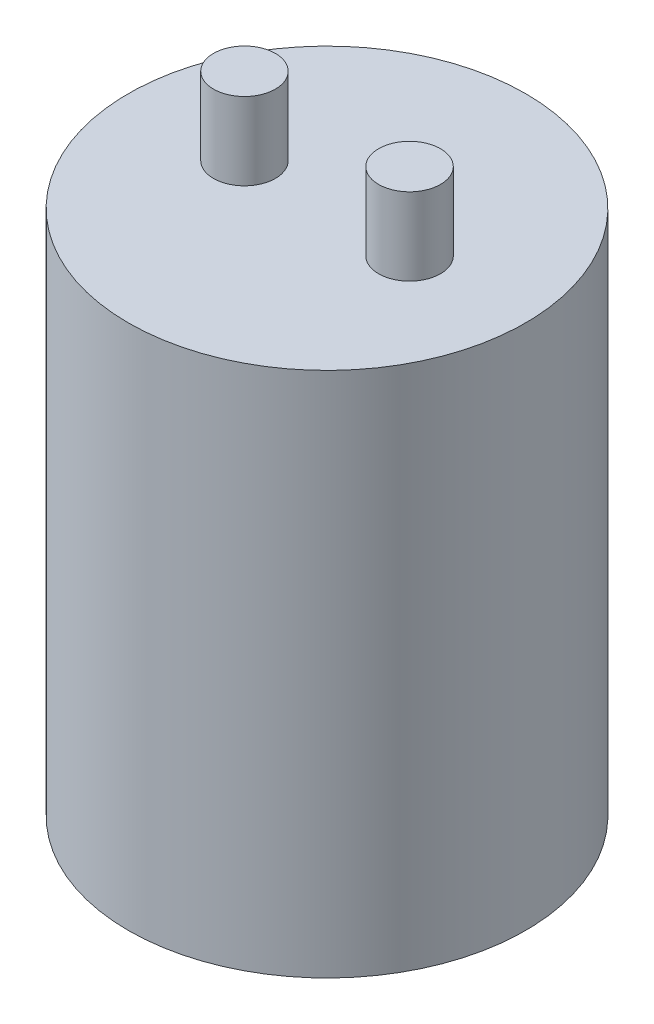
ISO-10303-21;
HEADER;
FILE_DESCRIPTION(('STEP AP214'),'2;1');
FILE_NAME('part.step','',(''),(''),'','','');
FILE_SCHEMA(('AUTOMOTIVE_DESIGN { 1 0 10303 214 1 1 1 1 }'));
ENDSEC;
DATA;
#1=APPLICATION_CONTEXT('core data for automotive mechanical design processes');
#2=APPLICATION_PROTOCOL_DEFINITION('international standard','automotive_design',2000,#1);
#3=PRODUCT_CONTEXT('',#1,'mechanical');
#4=PRODUCT('Part','Part','',(#3));
#5=PRODUCT_RELATED_PRODUCT_CATEGORY('part','',(#4));
#6=PRODUCT_DEFINITION_FORMATION('','',#4);
#7=PRODUCT_DEFINITION_CONTEXT('part definition',#1,'design');
#8=PRODUCT_DEFINITION('design','',#6,#7);
#9=PRODUCT_DEFINITION_SHAPE('','',#8);
#10=(LENGTH_UNIT() NAMED_UNIT(*) SI_UNIT(.MILLI.,.METRE.));
#11=(NAMED_UNIT(*) PLANE_ANGLE_UNIT() SI_UNIT($,.RADIAN.));
#12=(NAMED_UNIT(*) SI_UNIT($,.STERADIAN.) SOLID_ANGLE_UNIT());
#13=UNCERTAINTY_MEASURE_WITH_UNIT(LENGTH_MEASURE(1.E-05),#10,'distance_accuracy_value','');
#14=(GEOMETRIC_REPRESENTATION_CONTEXT(3) GLOBAL_UNCERTAINTY_ASSIGNED_CONTEXT((#13)) GLOBAL_UNIT_ASSIGNED_CONTEXT((#10,
#11,#12)) REPRESENTATION_CONTEXT('',''));
#15=CARTESIAN_POINT('',(0.,0.,0.));
#16=DIRECTION('',(0.,0.,1.));
#17=DIRECTION('',(1.,0.,0.));
#18=AXIS2_PLACEMENT_3D('',#15,#16,#17);
#19=CARTESIAN_POINT('',(0.,51.,0.));
#20=DIRECTION('',(0.,1.,0.));
#21=DIRECTION('',(0.,0.,1.));
#22=AXIS2_PLACEMENT_3D('',#19,#20,#21);
#23=PLANE('',#22);
#24=CARTESIAN_POINT('',(16.,51.,0.));
#25=DIRECTION('',(0.,1.,0.));
#26=DIRECTION('',(0.,0.,1.));
#27=AXIS2_PLACEMENT_3D('',#24,#25,#26);
#28=CIRCLE('',#27,6.);
#29=CARTESIAN_POINT('',(16.,51.,6.));
#30=VERTEX_POINT('',#29);
#31=EDGE_CURVE('E46',#30,#30,#28,.T.);
#32=ORIENTED_EDGE('',*,*,#31,.F.);
#33=EDGE_LOOP('',(#32));
#34=FACE_BOUND('',#33,.T.);
#35=CARTESIAN_POINT('',(0.,51.,0.));
#36=DIRECTION('',(0.,1.,0.));
#37=DIRECTION('',(0.,0.,1.));
#38=AXIS2_PLACEMENT_3D('',#35,#36,#37);
#39=CIRCLE('',#38,38.5);
#40=CARTESIAN_POINT('',(0.,51.,38.5));
#41=VERTEX_POINT('',#40);
#42=EDGE_CURVE('E10',#41,#41,#39,.T.);
#43=ORIENTED_EDGE('',*,*,#42,.T.);
#44=EDGE_LOOP('',(#43));
#45=FACE_BOUND('',#44,.T.);
#46=CARTESIAN_POINT('',(-16.,51.,0.));
#47=DIRECTION('',(0.,1.,0.));
#48=DIRECTION('',(0.,0.,-1.));
#49=AXIS2_PLACEMENT_3D('',#46,#47,#48);
#50=CIRCLE('',#49,6.);
#51=CARTESIAN_POINT('',(-16.,51.,-6.));
#52=VERTEX_POINT('',#51);
#53=EDGE_CURVE('E52',#52,#52,#50,.T.);
#54=ORIENTED_EDGE('',*,*,#53,.F.);
#55=EDGE_LOOP('',(#54));
#56=FACE_BOUND('',#55,.T.);
#57=ADVANCED_FACE('F33',(#34,#45,#56),#23,.T.);
#58=CARTESIAN_POINT('',(0.,51.,0.));
#59=DIRECTION('',(0.,-1.,0.));
#60=DIRECTION('',(0.,0.,-1.));
#61=AXIS2_PLACEMENT_3D('',#58,#59,#60);
#62=CYLINDRICAL_SURFACE('',#61,38.5);
#63=ORIENTED_EDGE('',*,*,#42,.F.);
#64=EDGE_LOOP('',(#63));
#65=FACE_BOUND('',#64,.T.);
#66=CARTESIAN_POINT('',(0.,-51.,0.));
#67=DIRECTION('',(0.,1.,0.));
#68=DIRECTION('',(0.,0.,1.));
#69=AXIS2_PLACEMENT_3D('',#66,#67,#68);
#70=CIRCLE('',#69,38.5);
#71=CARTESIAN_POINT('',(0.,-51.,38.5));
#72=VERTEX_POINT('',#71);
#73=EDGE_CURVE('E37',#72,#72,#70,.T.);
#74=ORIENTED_EDGE('',*,*,#73,.T.);
#75=EDGE_LOOP('',(#74));
#76=FACE_BOUND('',#75,.T.);
#77=ADVANCED_FACE('F35',(#65,#76),#62,.T.);
#78=CARTESIAN_POINT('',(0.,-51.,0.));
#79=DIRECTION('',(0.,1.,0.));
#80=DIRECTION('',(0.,0.,1.));
#81=AXIS2_PLACEMENT_3D('',#78,#79,#80);
#82=PLANE('',#81);
#83=ORIENTED_EDGE('',*,*,#73,.F.);
#84=EDGE_LOOP('',(#83));
#85=FACE_BOUND('',#84,.T.);
#86=ADVANCED_FACE('F73',(#85),#82,.F.);
#87=CARTESIAN_POINT('',(16.,66.,0.));
#88=DIRECTION('',(0.,-1.,0.));
#89=DIRECTION('',(0.,0.,-1.));
#90=AXIS2_PLACEMENT_3D('',#87,#88,#89);
#91=CYLINDRICAL_SURFACE('',#90,6.);
#92=CARTESIAN_POINT('',(16.,66.,0.));
#93=DIRECTION('',(0.,1.,0.));
#94=DIRECTION('',(0.,0.,1.));
#95=AXIS2_PLACEMENT_3D('',#92,#93,#94);
#96=CIRCLE('',#95,6.);
#97=CARTESIAN_POINT('',(16.,66.,6.));
#98=VERTEX_POINT('',#97);
#99=EDGE_CURVE('E44',#98,#98,#96,.T.);
#100=ORIENTED_EDGE('',*,*,#99,.F.);
#101=EDGE_LOOP('',(#100));
#102=FACE_BOUND('',#101,.T.);
#103=ORIENTED_EDGE('',*,*,#31,.T.);
#104=EDGE_LOOP('',(#103));
#105=FACE_BOUND('',#104,.T.);
#106=ADVANCED_FACE('F77',(#102,#105),#91,.T.);
#107=CARTESIAN_POINT('',(16.,66.,0.));
#108=DIRECTION('',(0.,1.,0.));
#109=DIRECTION('',(0.,0.,1.));
#110=AXIS2_PLACEMENT_3D('',#107,#108,#109);
#111=PLANE('',#110);
#112=ORIENTED_EDGE('',*,*,#99,.T.);
#113=EDGE_LOOP('',(#112));
#114=FACE_BOUND('',#113,.T.);
#115=ADVANCED_FACE('F63',(#114),#111,.T.);
#116=CARTESIAN_POINT('',(-16.,66.,0.));
#117=DIRECTION('',(0.,-1.,0.));
#118=DIRECTION('',(0.,0.,-1.));
#119=AXIS2_PLACEMENT_3D('',#116,#117,#118);
#120=CYLINDRICAL_SURFACE('',#119,6.);
#121=CARTESIAN_POINT('',(-16.,66.,0.));
#122=DIRECTION('',(0.,1.,0.));
#123=DIRECTION('',(0.,0.,-1.));
#124=AXIS2_PLACEMENT_3D('',#121,#122,#123);
#125=CIRCLE('',#124,6.);
#126=CARTESIAN_POINT('',(-16.,66.,-6.));
#127=VERTEX_POINT('',#126);
#128=EDGE_CURVE('E49',#127,#127,#125,.T.);
#129=ORIENTED_EDGE('',*,*,#128,.F.);
#130=EDGE_LOOP('',(#129));
#131=FACE_BOUND('',#130,.T.);
#132=ORIENTED_EDGE('',*,*,#53,.T.);
#133=EDGE_LOOP('',(#132));
#134=FACE_BOUND('',#133,.T.);
#135=ADVANCED_FACE('F60',(#131,#134),#120,.T.);
#136=CARTESIAN_POINT('',(-16.,66.,0.));
#137=DIRECTION('',(0.,-1.,0.));
#138=DIRECTION('',(0.,0.,-1.));
#139=AXIS2_PLACEMENT_3D('',#136,#137,#138);
#140=PLANE('',#139);
#141=ORIENTED_EDGE('',*,*,#128,.T.);
#142=EDGE_LOOP('',(#141));
#143=FACE_BOUND('',#142,.T.);
#144=ADVANCED_FACE('F58',(#143),#140,.F.);
#145=CLOSED_SHELL('',(#57,#77,#86,#106,#115,#135,#144));
#146=MANIFOLD_SOLID_BREP('B2',#145);
#147=ADVANCED_BREP_SHAPE_REPRESENTATION('',(#18,#146),#14);
#148=SHAPE_DEFINITION_REPRESENTATION(#9,#147);
ENDSEC;
END-ISO-10303-21;
